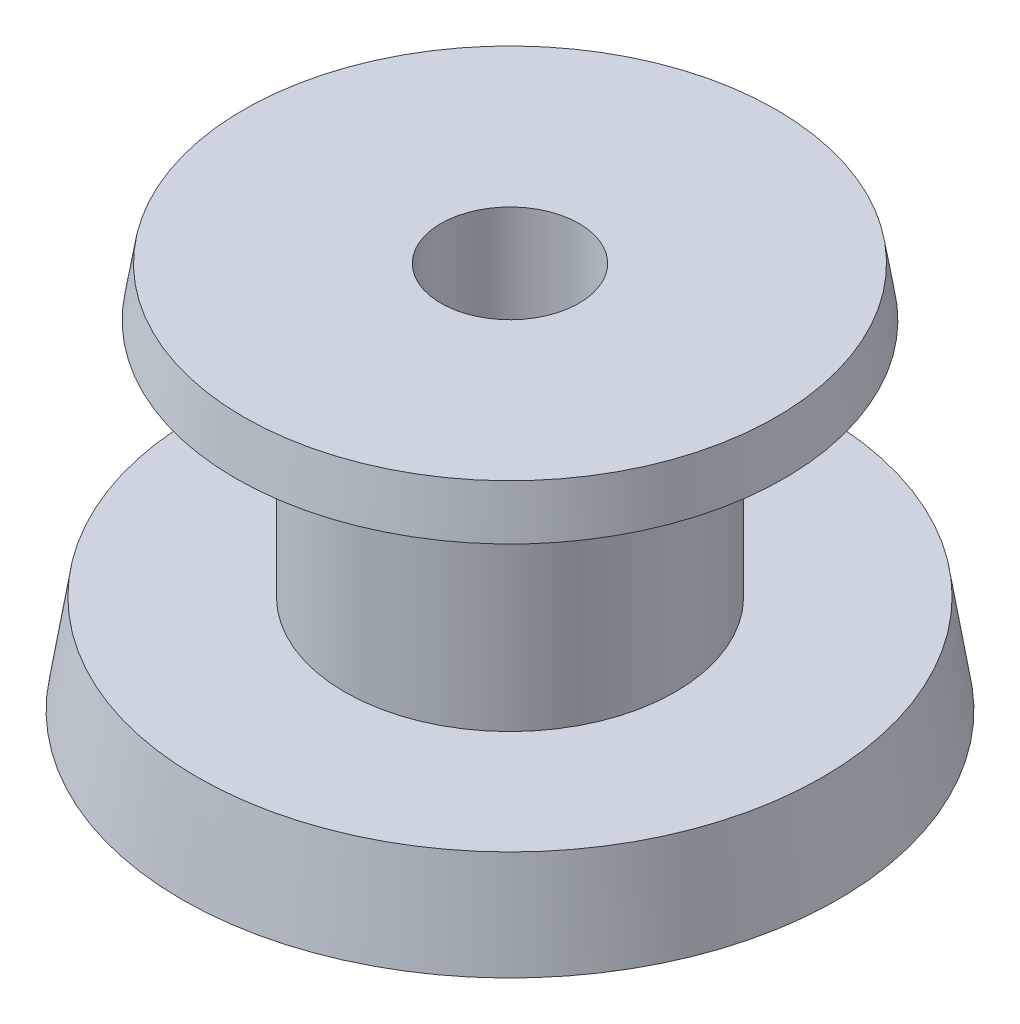
ISO-10303-21;
HEADER;
FILE_DESCRIPTION(('STEP AP214'),'2;1');
FILE_NAME('part.step','',(''),(''),'','','');
FILE_SCHEMA(('AUTOMOTIVE_DESIGN { 1 0 10303 214 1 1 1 1 }'));
ENDSEC;
DATA;
#1=APPLICATION_CONTEXT('core data for automotive mechanical design processes');
#2=APPLICATION_PROTOCOL_DEFINITION('international standard','automotive_design',2000,#1);
#3=PRODUCT_CONTEXT('',#1,'mechanical');
#4=PRODUCT('Part','Part','',(#3));
#5=PRODUCT_RELATED_PRODUCT_CATEGORY('part','',(#4));
#6=PRODUCT_DEFINITION_FORMATION('','',#4);
#7=PRODUCT_DEFINITION_CONTEXT('part definition',#1,'design');
#8=PRODUCT_DEFINITION('design','',#6,#7);
#9=PRODUCT_DEFINITION_SHAPE('','',#8);
#10=(LENGTH_UNIT() NAMED_UNIT(*) SI_UNIT(.MILLI.,.METRE.));
#11=(NAMED_UNIT(*) PLANE_ANGLE_UNIT() SI_UNIT($,.RADIAN.));
#12=(NAMED_UNIT(*) SI_UNIT($,.STERADIAN.) SOLID_ANGLE_UNIT());
#13=UNCERTAINTY_MEASURE_WITH_UNIT(LENGTH_MEASURE(1.E-05),#10,'distance_accuracy_value','');
#14=(GEOMETRIC_REPRESENTATION_CONTEXT(3) GLOBAL_UNCERTAINTY_ASSIGNED_CONTEXT((#13)) GLOBAL_UNIT_ASSIGNED_CONTEXT((#10,
#11,#12)) REPRESENTATION_CONTEXT('',''));
#15=CARTESIAN_POINT('',(0.,0.,0.));
#16=DIRECTION('',(0.,0.,1.));
#17=DIRECTION('',(1.,0.,0.));
#18=AXIS2_PLACEMENT_3D('',#15,#16,#17);
#19=CARTESIAN_POINT('',(0.,0.,0.));
#20=DIRECTION('',(0.,-1.,0.));
#21=DIRECTION('',(0.,0.,-1.));
#22=AXIS2_PLACEMENT_3D('',#19,#20,#21);
#23=DEGENERATE_TOROIDAL_SURFACE('',#22,2501.8361840796,2549.0801840796,.F.);
#24=CARTESIAN_POINT('',(0.,411.8,0.));
#25=DIRECTION('',(0.,-1.,0.));
#26=DIRECTION('',(0.,0.,-1.));
#27=AXIS2_PLACEMENT_3D('',#24,#25,#26);
#28=CIRCLE('',#27,13.7612687866744);
#29=CARTESIAN_POINT('',(0.,411.8,-13.7612687866744));
#30=VERTEX_POINT('',#29);
#31=EDGE_CURVE('E102',#30,#30,#28,.F.);
#32=ORIENTED_EDGE('',*,*,#31,.F.);
#33=EDGE_LOOP('',(#32));
#34=FACE_BOUND('',#33,.T.);
#35=CARTESIAN_POINT('',(0.,409.26,0.));
#36=DIRECTION('',(0.,1.,0.));
#37=DIRECTION('',(0.,0.,1.));
#38=AXIS2_PLACEMENT_3D('',#35,#36,#37);
#39=CIRCLE('',#38,14.175746986564);
#40=CARTESIAN_POINT('',(0.,409.26,14.175746986564));
#41=VERTEX_POINT('',#40);
#42=EDGE_CURVE('E88',#41,#41,#39,.T.);
#43=ORIENTED_EDGE('',*,*,#42,.T.);
#44=EDGE_LOOP('',(#43));
#45=FACE_BOUND('',#44,.T.);
#46=ADVANCED_FACE('F67',(#34,#45),#23,.F.);
#47=CARTESIAN_POINT('',(0.,396.88,0.));
#48=DIRECTION('',(0.,1.,0.));
#49=DIRECTION('',(0.,0.,1.));
#50=AXIS2_PLACEMENT_3D('',#47,#48,#49);
#51=CIRCLE('',#50,16.1582659673591);
#52=CARTESIAN_POINT('',(0.,396.88,16.1582659673591));
#53=VERTEX_POINT('',#52);
#54=EDGE_CURVE('E71',#53,#53,#51,.T.);
#55=ORIENTED_EDGE('',*,*,#54,.F.);
#56=EDGE_LOOP('',(#55));
#57=FACE_BOUND('',#56,.T.);
#58=CARTESIAN_POINT('',(0.,391.8,0.));
#59=DIRECTION('',(0.,1.,0.));
#60=DIRECTION('',(0.,0.,1.));
#61=AXIS2_PLACEMENT_3D('',#58,#59,#60);
#62=CIRCLE('',#61,16.9537128485437);
#63=CARTESIAN_POINT('',(0.,391.8,16.9537128485437));
#64=VERTEX_POINT('',#63);
#65=EDGE_CURVE('E91',#64,#64,#62,.F.);
#66=ORIENTED_EDGE('',*,*,#65,.F.);
#67=EDGE_LOOP('',(#66));
#68=FACE_BOUND('',#67,.T.);
#69=ADVANCED_FACE('F69',(#57,#68),#23,.F.);
#70=CARTESIAN_POINT('',(-74.9546060272492,391.8,-50.8));
#71=DIRECTION('',(0.,1.,0.));
#72=DIRECTION('',(0.,0.,1.));
#73=AXIS2_PLACEMENT_3D('',#70,#71,#72);
#74=PLANE('',#73);
#75=CARTESIAN_POINT('',(0.,391.8,0.));
#76=DIRECTION('',(0.,-1.,0.));
#77=DIRECTION('',(0.,0.,-1.));
#78=AXIS2_PLACEMENT_3D('',#75,#76,#77);
#79=CIRCLE('',#78,10.95375);
#80=CARTESIAN_POINT('',(0.,391.8,-10.95375));
#81=VERTEX_POINT('',#80);
#82=EDGE_CURVE('E84',#81,#81,#79,.T.);
#83=ORIENTED_EDGE('',*,*,#82,.F.);
#84=EDGE_LOOP('',(#83));
#85=FACE_BOUND('',#84,.T.);
#86=ORIENTED_EDGE('',*,*,#65,.T.);
#87=EDGE_LOOP('',(#86));
#88=FACE_BOUND('',#87,.T.);
#89=ADVANCED_FACE('F120',(#85,#88),#74,.F.);
#90=CARTESIAN_POINT('',(-13.7612687866744,411.8,-50.8));
#91=DIRECTION('',(0.,-1.,0.));
#92=DIRECTION('',(0.,0.,-1.));
#93=AXIS2_PLACEMENT_3D('',#90,#91,#92);
#94=PLANE('',#93);
#95=CARTESIAN_POINT('',(0.,411.8,0.));
#96=DIRECTION('',(0.,-1.,0.));
#97=DIRECTION('',(0.,0.,-1.));
#98=AXIS2_PLACEMENT_3D('',#95,#96,#97);
#99=CIRCLE('',#98,3.57123999999999);
#100=CARTESIAN_POINT('',(0.,411.8,-3.57123999999999));
#101=VERTEX_POINT('',#100);
#102=EDGE_CURVE('E96',#101,#101,#99,.T.);
#103=ORIENTED_EDGE('',*,*,#102,.T.);
#104=EDGE_LOOP('',(#103));
#105=FACE_BOUND('',#104,.T.);
#106=ORIENTED_EDGE('',*,*,#31,.T.);
#107=EDGE_LOOP('',(#106));
#108=FACE_BOUND('',#107,.T.);
#109=ADVANCED_FACE('F122',(#105,#108),#94,.F.);
#110=CARTESIAN_POINT('',(0.,391.8,0.));
#111=DIRECTION('',(0.,-1.,0.));
#112=DIRECTION('',(0.,0.,-1.));
#113=AXIS2_PLACEMENT_3D('',#110,#111,#112);
#114=CYLINDRICAL_SURFACE('',#113,3.57123999999999);
#115=CARTESIAN_POINT('',(0.,395.991,0.));
#116=DIRECTION('',(0.,-1.,0.));
#117=DIRECTION('',(0.,0.,-1.));
#118=AXIS2_PLACEMENT_3D('',#115,#116,#117);
#119=CIRCLE('',#118,3.57124);
#120=CARTESIAN_POINT('',(0.,395.991,-3.57124));
#121=VERTEX_POINT('',#120);
#122=EDGE_CURVE('E106',#121,#121,#119,.T.);
#123=ORIENTED_EDGE('',*,*,#122,.T.);
#124=EDGE_LOOP('',(#123));
#125=FACE_BOUND('',#124,.T.);
#126=ORIENTED_EDGE('',*,*,#102,.F.);
#127=EDGE_LOOP('',(#126));
#128=FACE_BOUND('',#127,.T.);
#129=ADVANCED_FACE('F128',(#125,#128),#114,.F.);
#130=CARTESIAN_POINT('',(3.57124,395.991,0.));
#131=DIRECTION('',(0.,1.,0.));
#132=DIRECTION('',(0.,0.,1.));
#133=AXIS2_PLACEMENT_3D('',#130,#131,#132);
#134=PLANE('',#133);
#135=ORIENTED_EDGE('',*,*,#122,.F.);
#136=EDGE_LOOP('',(#135));
#137=FACE_BOUND('',#136,.T.);
#138=CARTESIAN_POINT('',(0.,395.991,0.));
#139=DIRECTION('',(0.,-1.,0.));
#140=DIRECTION('',(0.,0.,-1.));
#141=AXIS2_PLACEMENT_3D('',#138,#139,#140);
#142=CIRCLE('',#141,10.95375);
#143=CARTESIAN_POINT('',(0.,395.991,-10.95375));
#144=VERTEX_POINT('',#143);
#145=EDGE_CURVE('E109',#144,#144,#142,.T.);
#146=ORIENTED_EDGE('',*,*,#145,.T.);
#147=EDGE_LOOP('',(#146));
#148=FACE_BOUND('',#147,.T.);
#149=ADVANCED_FACE('F165',(#137,#148),#134,.F.);
#150=CARTESIAN_POINT('',(0.,391.8,0.));
#151=DIRECTION('',(0.,-1.,0.));
#152=DIRECTION('',(0.,0.,-1.));
#153=AXIS2_PLACEMENT_3D('',#150,#151,#152);
#154=CYLINDRICAL_SURFACE('',#153,10.95375);
#155=ORIENTED_EDGE('',*,*,#145,.F.);
#156=EDGE_LOOP('',(#155));
#157=FACE_BOUND('',#156,.T.);
#158=ORIENTED_EDGE('',*,*,#82,.T.);
#159=EDGE_LOOP('',(#158));
#160=FACE_BOUND('',#159,.T.);
#161=ADVANCED_FACE('F118',(#157,#160),#154,.F.);
#162=CARTESIAN_POINT('',(0.,409.26,14.175746986564));
#163=DIRECTION('',(0.,1.,0.));
#164=DIRECTION('',(0.,0.,1.));
#165=AXIS2_PLACEMENT_3D('',#162,#163,#164);
#166=PLANE('',#165);
#167=ORIENTED_EDGE('',*,*,#42,.F.);
#168=EDGE_LOOP('',(#167));
#169=FACE_BOUND('',#168,.T.);
#170=CARTESIAN_POINT('',(0.,409.26,0.));
#171=DIRECTION('',(0.,1.,0.));
#172=DIRECTION('',(0.,0.,1.));
#173=AXIS2_PLACEMENT_3D('',#170,#171,#172);
#174=CIRCLE('',#173,8.53826596735914);
#175=CARTESIAN_POINT('',(0.,409.26,8.53826596735914));
#176=VERTEX_POINT('',#175);
#177=EDGE_CURVE('E81',#176,#176,#174,.T.);
#178=ORIENTED_EDGE('',*,*,#177,.T.);
#179=EDGE_LOOP('',(#178));
#180=FACE_BOUND('',#179,.T.);
#181=ADVANCED_FACE('F184',(#169,#180),#166,.F.);
#182=CARTESIAN_POINT('',(0.,396.88,16.1582659673591));
#183=DIRECTION('',(0.,-1.,0.));
#184=DIRECTION('',(0.,0.,-1.));
#185=AXIS2_PLACEMENT_3D('',#182,#183,#184);
#186=PLANE('',#185);
#187=CARTESIAN_POINT('',(0.,396.88,0.));
#188=DIRECTION('',(0.,1.,0.));
#189=DIRECTION('',(0.,0.,1.));
#190=AXIS2_PLACEMENT_3D('',#187,#188,#189);
#191=CIRCLE('',#190,8.53826596735914);
#192=CARTESIAN_POINT('',(0.,396.88,8.53826596735914));
#193=VERTEX_POINT('',#192);
#194=EDGE_CURVE('E11',#193,#193,#191,.T.);
#195=ORIENTED_EDGE('',*,*,#194,.F.);
#196=EDGE_LOOP('',(#195));
#197=FACE_BOUND('',#196,.T.);
#198=ORIENTED_EDGE('',*,*,#54,.T.);
#199=EDGE_LOOP('',(#198));
#200=FACE_BOUND('',#199,.T.);
#201=ADVANCED_FACE('F194',(#197,#200),#186,.F.);
#202=CARTESIAN_POINT('',(0.,412.19120211488,0.));
#203=DIRECTION('',(0.,1.,0.));
#204=DIRECTION('',(0.,0.,1.));
#205=AXIS2_PLACEMENT_3D('',#202,#203,#204);
#206=CYLINDRICAL_SURFACE('',#205,8.53826596735914);
#207=ORIENTED_EDGE('',*,*,#177,.F.);
#208=EDGE_LOOP('',(#207));
#209=FACE_BOUND('',#208,.T.);
#210=ORIENTED_EDGE('',*,*,#194,.T.);
#211=EDGE_LOOP('',(#210));
#212=FACE_BOUND('',#211,.T.);
#213=ADVANCED_FACE('F204',(#209,#212),#206,.T.);
#214=CLOSED_SHELL('',(#46,#69,#89,#109,#129,#149,#161,#181,#201,#213));
#215=MANIFOLD_SOLID_BREP('B2',#214);
#216=ADVANCED_BREP_SHAPE_REPRESENTATION('',(#18,#215),#14);
#217=SHAPE_DEFINITION_REPRESENTATION(#9,#216);
ENDSEC;
END-ISO-10303-21;
